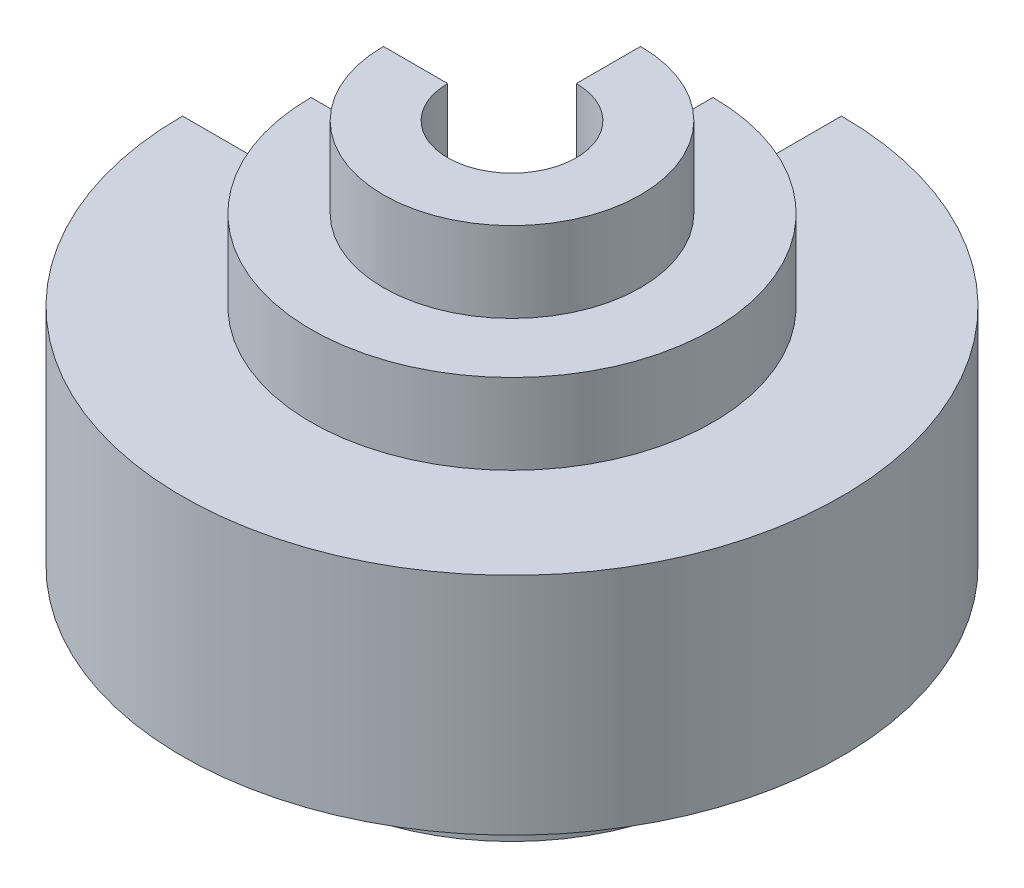
ISO-10303-21;
HEADER;
FILE_DESCRIPTION(('STEP AP214'),'2;1');
FILE_NAME('part.step','',(''),(''),'','','');
FILE_SCHEMA(('AUTOMOTIVE_DESIGN { 1 0 10303 214 1 1 1 1 }'));
ENDSEC;
DATA;
#1=APPLICATION_CONTEXT('core data for automotive mechanical design processes');
#2=APPLICATION_PROTOCOL_DEFINITION('international standard','automotive_design',2000,#1);
#3=PRODUCT_CONTEXT('',#1,'mechanical');
#4=PRODUCT('Part','Part','',(#3));
#5=PRODUCT_RELATED_PRODUCT_CATEGORY('part','',(#4));
#6=PRODUCT_DEFINITION_FORMATION('','',#4);
#7=PRODUCT_DEFINITION_CONTEXT('part definition',#1,'design');
#8=PRODUCT_DEFINITION('design','',#6,#7);
#9=PRODUCT_DEFINITION_SHAPE('','',#8);
#10=(LENGTH_UNIT() NAMED_UNIT(*) SI_UNIT(.MILLI.,.METRE.));
#11=(NAMED_UNIT(*) PLANE_ANGLE_UNIT() SI_UNIT($,.RADIAN.));
#12=(NAMED_UNIT(*) SI_UNIT($,.STERADIAN.) SOLID_ANGLE_UNIT());
#13=UNCERTAINTY_MEASURE_WITH_UNIT(LENGTH_MEASURE(1.E-05),#10,'distance_accuracy_value','');
#14=(GEOMETRIC_REPRESENTATION_CONTEXT(3) GLOBAL_UNCERTAINTY_ASSIGNED_CONTEXT((#13)) GLOBAL_UNIT_ASSIGNED_CONTEXT((#10,
#11,#12)) REPRESENTATION_CONTEXT('',''));
#15=CARTESIAN_POINT('',(0.,0.,0.));
#16=DIRECTION('',(0.,0.,1.));
#17=DIRECTION('',(1.,0.,0.));
#18=AXIS2_PLACEMENT_3D('',#15,#16,#17);
#19=CARTESIAN_POINT('',(0.,-107.271307940973,0.));
#20=DIRECTION('',(0.,-1.,0.));
#21=DIRECTION('',(0.,0.,-1.));
#22=AXIS2_PLACEMENT_3D('',#19,#20,#21);
#23=CYLINDRICAL_SURFACE('',#22,40.);
#24=CARTESIAN_POINT('',(0.,192.728692059027,0.));
#25=DIRECTION('',(0.,-1.,0.));
#26=DIRECTION('',(0.,0.,-1.));
#27=AXIS2_PLACEMENT_3D('',#24,#25,#26);
#28=CIRCLE('',#27,40.);
#29=CARTESIAN_POINT('',(-4.18977760661176E-13,192.728692059027,-40.));
#30=VERTEX_POINT('',#29);
#31=CARTESIAN_POINT('',(-40.,192.728692059027,0.));
#32=VERTEX_POINT('',#31);
#33=EDGE_CURVE('E11',#30,#32,#28,.T.);
#34=ORIENTED_EDGE('',*,*,#33,.F.);
#35=DIRECTION('',(0.,1.,0.));
#36=VECTOR('',#35,1.);
#37=CARTESIAN_POINT('',(-4.18977760661176E-13,107.728692059027,-40.));
#38=LINE('',#37,#36);
#39=CARTESIAN_POINT('',(-4.18977760661176E-13,107.728692059027,-40.));
#40=VERTEX_POINT('',#39);
#41=EDGE_CURVE('E204',#40,#30,#38,.T.);
#42=ORIENTED_EDGE('',*,*,#41,.F.);
#43=CARTESIAN_POINT('',(0.,107.728692059027,0.));
#44=DIRECTION('',(0.,-1.,0.));
#45=DIRECTION('',(0.,0.,-1.));
#46=AXIS2_PLACEMENT_3D('',#43,#44,#45);
#47=CIRCLE('',#46,40.);
#48=CARTESIAN_POINT('',(-40.,107.728692059027,0.));
#49=VERTEX_POINT('',#48);
#50=EDGE_CURVE('E48',#40,#49,#47,.T.);
#51=ORIENTED_EDGE('',*,*,#50,.T.);
#52=DIRECTION('',(0.,1.,0.));
#53=VECTOR('',#52,1.);
#54=CARTESIAN_POINT('',(-40.,107.728692059027,0.));
#55=LINE('',#54,#53);
#56=EDGE_CURVE('E156',#49,#32,#55,.T.);
#57=ORIENTED_EDGE('',*,*,#56,.T.);
#58=EDGE_LOOP('',(#34,#42,#51,#57));
#59=FACE_BOUND('',#58,.T.);
#60=ADVANCED_FACE('F33',(#59),#23,.F.);
#61=CARTESIAN_POINT('',(-4.18977760661176E-13,192.728692059027,-40.));
#62=DIRECTION('',(0.,-1.,0.));
#63=DIRECTION('',(0.,0.,-1.));
#64=AXIS2_PLACEMENT_3D('',#61,#62,#63);
#65=PLANE('',#64);
#66=CARTESIAN_POINT('',(0.,192.728692059027,0.));
#67=DIRECTION('',(0.,-1.,0.));
#68=DIRECTION('',(0.,0.,-1.));
#69=AXIS2_PLACEMENT_3D('',#66,#67,#68);
#70=CIRCLE('',#69,80.);
#71=CARTESIAN_POINT('',(-8.37955521322352E-13,192.728692059027,-80.));
#72=VERTEX_POINT('',#71);
#73=CARTESIAN_POINT('',(-80.,192.728692059027,0.));
#74=VERTEX_POINT('',#73);
#75=EDGE_CURVE('E41',#72,#74,#70,.T.);
#76=ORIENTED_EDGE('',*,*,#75,.F.);
#77=DIRECTION('',(0.,0.,-1.));
#78=VECTOR('',#77,1.);
#79=CARTESIAN_POINT('',(-4.18977760661176E-13,192.728692059027,-40.));
#80=LINE('',#79,#78);
#81=EDGE_CURVE('E152',#30,#72,#80,.T.);
#82=ORIENTED_EDGE('',*,*,#81,.F.);
#83=ORIENTED_EDGE('',*,*,#33,.T.);
#84=DIRECTION('',(-1.,0.,0.));
#85=VECTOR('',#84,1.);
#86=CARTESIAN_POINT('',(-40.,192.728692059027,0.));
#87=LINE('',#86,#85);
#88=EDGE_CURVE('E149',#32,#74,#87,.T.);
#89=ORIENTED_EDGE('',*,*,#88,.T.);
#90=EDGE_LOOP('',(#76,#82,#83,#89));
#91=FACE_BOUND('',#90,.T.);
#92=ADVANCED_FACE('F35',(#91),#65,.F.);
#93=CARTESIAN_POINT('',(0.,-107.271307940973,0.));
#94=DIRECTION('',(0.,-1.,0.));
#95=DIRECTION('',(0.,0.,-1.));
#96=AXIS2_PLACEMENT_3D('',#93,#94,#95);
#97=CYLINDRICAL_SURFACE('',#96,80.);
#98=CARTESIAN_POINT('',(0.,142.728692059027,0.));
#99=DIRECTION('',(0.,-1.,0.));
#100=DIRECTION('',(0.,0.,-1.));
#101=AXIS2_PLACEMENT_3D('',#98,#99,#100);
#102=CIRCLE('',#101,80.);
#103=CARTESIAN_POINT('',(-8.37955521322352E-13,142.728692059027,-80.));
#104=VERTEX_POINT('',#103);
#105=CARTESIAN_POINT('',(-80.,142.728692059027,0.));
#106=VERTEX_POINT('',#105);
#107=EDGE_CURVE('E272',#104,#106,#102,.T.);
#108=ORIENTED_EDGE('',*,*,#107,.F.);
#109=DIRECTION('',(0.,-1.,0.));
#110=VECTOR('',#109,1.);
#111=CARTESIAN_POINT('',(-8.37955521322352E-13,192.728692059027,-80.));
#112=LINE('',#111,#110);
#113=EDGE_CURVE('E207',#72,#104,#112,.T.);
#114=ORIENTED_EDGE('',*,*,#113,.F.);
#115=ORIENTED_EDGE('',*,*,#75,.T.);
#116=DIRECTION('',(0.,-1.,0.));
#117=VECTOR('',#116,1.);
#118=CARTESIAN_POINT('',(-80.,192.728692059027,0.));
#119=LINE('',#118,#117);
#120=EDGE_CURVE('E163',#74,#106,#119,.T.);
#121=ORIENTED_EDGE('',*,*,#120,.T.);
#122=EDGE_LOOP('',(#108,#114,#115,#121));
#123=FACE_BOUND('',#122,.T.);
#124=ADVANCED_FACE('F275',(#123),#97,.T.);
#125=CARTESIAN_POINT('',(-8.37955521322352E-13,142.728692059027,-80.));
#126=DIRECTION('',(0.,-1.,0.));
#127=DIRECTION('',(0.,0.,-1.));
#128=AXIS2_PLACEMENT_3D('',#125,#126,#127);
#129=PLANE('',#128);
#130=CARTESIAN_POINT('',(0.,142.728692059027,0.));
#131=DIRECTION('',(0.,-1.,0.));
#132=DIRECTION('',(0.,0.,-1.));
#133=AXIS2_PLACEMENT_3D('',#130,#131,#132);
#134=CIRCLE('',#133,125.);
#135=CARTESIAN_POINT('',(-1.30930550206618E-12,142.728692059027,-125.));
#136=VERTEX_POINT('',#135);
#137=CARTESIAN_POINT('',(-125.,142.728692059027,0.));
#138=VERTEX_POINT('',#137);
#139=EDGE_CURVE('E270',#136,#138,#134,.T.);
#140=ORIENTED_EDGE('',*,*,#139,.F.);
#141=DIRECTION('',(0.,0.,-1.));
#142=VECTOR('',#141,1.);
#143=CARTESIAN_POINT('',(-8.37955521322352E-13,142.728692059027,-80.));
#144=LINE('',#143,#142);
#145=EDGE_CURVE('E210',#104,#136,#144,.T.);
#146=ORIENTED_EDGE('',*,*,#145,.F.);
#147=ORIENTED_EDGE('',*,*,#107,.T.);
#148=DIRECTION('',(-1.,0.,0.));
#149=VECTOR('',#148,1.);
#150=CARTESIAN_POINT('',(-80.,142.728692059027,0.));
#151=LINE('',#150,#149);
#152=EDGE_CURVE('E165',#106,#138,#151,.T.);
#153=ORIENTED_EDGE('',*,*,#152,.T.);
#154=EDGE_LOOP('',(#140,#146,#147,#153));
#155=FACE_BOUND('',#154,.T.);
#156=ADVANCED_FACE('F323',(#155),#129,.F.);
#157=CARTESIAN_POINT('',(0.,-107.271307940973,0.));
#158=DIRECTION('',(0.,-1.,0.));
#159=DIRECTION('',(0.,0.,-1.));
#160=AXIS2_PLACEMENT_3D('',#157,#158,#159);
#161=CYLINDRICAL_SURFACE('',#160,125.);
#162=CARTESIAN_POINT('',(0.,92.7286920590267,0.));
#163=DIRECTION('',(0.,-1.,0.));
#164=DIRECTION('',(0.,0.,-1.));
#165=AXIS2_PLACEMENT_3D('',#162,#163,#164);
#166=CIRCLE('',#165,125.);
#167=CARTESIAN_POINT('',(-1.30930550206618E-12,92.7286920590267,-125.));
#168=VERTEX_POINT('',#167);
#169=CARTESIAN_POINT('',(-125.,92.7286920590267,0.));
#170=VERTEX_POINT('',#169);
#171=EDGE_CURVE('E268',#168,#170,#166,.T.);
#172=ORIENTED_EDGE('',*,*,#171,.F.);
#173=DIRECTION('',(0.,-1.,0.));
#174=VECTOR('',#173,1.);
#175=CARTESIAN_POINT('',(-1.30930550206618E-12,142.728692059027,-125.));
#176=LINE('',#175,#174);
#177=EDGE_CURVE('E213',#136,#168,#176,.T.);
#178=ORIENTED_EDGE('',*,*,#177,.F.);
#179=ORIENTED_EDGE('',*,*,#139,.T.);
#180=DIRECTION('',(0.,-1.,0.));
#181=VECTOR('',#180,1.);
#182=CARTESIAN_POINT('',(-125.,142.728692059027,0.));
#183=LINE('',#182,#181);
#184=EDGE_CURVE('E170',#138,#170,#183,.T.);
#185=ORIENTED_EDGE('',*,*,#184,.T.);
#186=EDGE_LOOP('',(#172,#178,#179,#185));
#187=FACE_BOUND('',#186,.T.);
#188=ADVANCED_FACE('F320',(#187),#161,.T.);
#189=CARTESIAN_POINT('',(-1.30930550206618E-12,92.7286920590267,-125.));
#190=DIRECTION('',(0.,-1.,0.));
#191=DIRECTION('',(0.,0.,-1.));
#192=AXIS2_PLACEMENT_3D('',#189,#190,#191);
#193=PLANE('',#192);
#194=CARTESIAN_POINT('',(0.,92.7286920590267,0.));
#195=DIRECTION('',(0.,-1.,0.));
#196=DIRECTION('',(0.,0.,-1.));
#197=AXIS2_PLACEMENT_3D('',#194,#195,#196);
#198=CIRCLE('',#197,205.);
#199=CARTESIAN_POINT('',(-2.14726102338853E-12,92.7286920590267,-205.));
#200=VERTEX_POINT('',#199);
#201=CARTESIAN_POINT('',(-205.,92.7286920590267,0.));
#202=VERTEX_POINT('',#201);
#203=EDGE_CURVE('E266',#200,#202,#198,.T.);
#204=ORIENTED_EDGE('',*,*,#203,.F.);
#205=DIRECTION('',(0.,0.,-1.));
#206=VECTOR('',#205,1.);
#207=CARTESIAN_POINT('',(-1.30930550206618E-12,92.7286920590267,-125.));
#208=LINE('',#207,#206);
#209=EDGE_CURVE('E216',#168,#200,#208,.T.);
#210=ORIENTED_EDGE('',*,*,#209,.F.);
#211=ORIENTED_EDGE('',*,*,#171,.T.);
#212=DIRECTION('',(-1.,0.,0.));
#213=VECTOR('',#212,1.);
#214=CARTESIAN_POINT('',(-125.,92.7286920590267,0.));
#215=LINE('',#214,#213);
#216=EDGE_CURVE('E173',#170,#202,#215,.T.);
#217=ORIENTED_EDGE('',*,*,#216,.T.);
#218=EDGE_LOOP('',(#204,#210,#211,#217));
#219=FACE_BOUND('',#218,.T.);
#220=ADVANCED_FACE('F317',(#219),#193,.F.);
#221=CARTESIAN_POINT('',(0.,-107.271307940973,0.));
#222=DIRECTION('',(0.,-1.,0.));
#223=DIRECTION('',(0.,0.,-1.));
#224=AXIS2_PLACEMENT_3D('',#221,#222,#223);
#225=CYLINDRICAL_SURFACE('',#224,205.);
#226=CARTESIAN_POINT('',(0.,-47.2713079409733,0.));
#227=DIRECTION('',(0.,-1.,0.));
#228=DIRECTION('',(0.,0.,-1.));
#229=AXIS2_PLACEMENT_3D('',#226,#227,#228);
#230=CIRCLE('',#229,205.);
#231=CARTESIAN_POINT('',(-2.14726102338853E-12,-47.2713079409733,-205.));
#232=VERTEX_POINT('',#231);
#233=CARTESIAN_POINT('',(-205.,-47.2713079409733,0.));
#234=VERTEX_POINT('',#233);
#235=EDGE_CURVE('E264',#232,#234,#230,.T.);
#236=ORIENTED_EDGE('',*,*,#235,.F.);
#237=DIRECTION('',(0.,-1.,0.));
#238=VECTOR('',#237,1.);
#239=CARTESIAN_POINT('',(-2.14726102338853E-12,92.7286920590267,-205.));
#240=LINE('',#239,#238);
#241=EDGE_CURVE('E219',#200,#232,#240,.T.);
#242=ORIENTED_EDGE('',*,*,#241,.F.);
#243=ORIENTED_EDGE('',*,*,#203,.T.);
#244=DIRECTION('',(0.,-1.,0.));
#245=VECTOR('',#244,1.);
#246=CARTESIAN_POINT('',(-205.,92.7286920590267,0.));
#247=LINE('',#246,#245);
#248=EDGE_CURVE('E176',#202,#234,#247,.T.);
#249=ORIENTED_EDGE('',*,*,#248,.T.);
#250=EDGE_LOOP('',(#236,#242,#243,#249));
#251=FACE_BOUND('',#250,.T.);
#252=ADVANCED_FACE('F314',(#251),#225,.T.);
#253=CARTESIAN_POINT('',(-2.14726102338853E-12,-47.2713079409733,-205.));
#254=DIRECTION('',(0.,1.,0.));
#255=DIRECTION('',(0.,0.,1.));
#256=AXIS2_PLACEMENT_3D('',#253,#254,#255);
#257=PLANE('',#256);
#258=CARTESIAN_POINT('',(0.,-47.2713079409733,0.));
#259=DIRECTION('',(0.,-1.,0.));
#260=DIRECTION('',(0.,0.,-1.));
#261=AXIS2_PLACEMENT_3D('',#258,#259,#260);
#262=CIRCLE('',#261,125.);
#263=CARTESIAN_POINT('',(-1.30930550206617E-12,-47.2713079409733,-125.));
#264=VERTEX_POINT('',#263);
#265=CARTESIAN_POINT('',(-125.,-47.2713079409733,0.));
#266=VERTEX_POINT('',#265);
#267=EDGE_CURVE('E262',#264,#266,#262,.T.);
#268=ORIENTED_EDGE('',*,*,#267,.F.);
#269=DIRECTION('',(0.,0.,1.));
#270=VECTOR('',#269,1.);
#271=CARTESIAN_POINT('',(-2.14726102338853E-12,-47.2713079409733,-205.));
#272=LINE('',#271,#270);
#273=EDGE_CURVE('E222',#232,#264,#272,.T.);
#274=ORIENTED_EDGE('',*,*,#273,.F.);
#275=ORIENTED_EDGE('',*,*,#235,.T.);
#276=DIRECTION('',(1.,0.,0.));
#277=VECTOR('',#276,1.);
#278=CARTESIAN_POINT('',(-205.,-47.2713079409733,0.));
#279=LINE('',#278,#277);
#280=EDGE_CURVE('E179',#234,#266,#279,.T.);
#281=ORIENTED_EDGE('',*,*,#280,.T.);
#282=EDGE_LOOP('',(#268,#274,#275,#281));
#283=FACE_BOUND('',#282,.T.);
#284=ADVANCED_FACE('F310',(#283),#257,.F.);
#285=CARTESIAN_POINT('',(0.,-107.271307940973,0.));
#286=DIRECTION('',(0.,-1.,0.));
#287=DIRECTION('',(0.,0.,-1.));
#288=AXIS2_PLACEMENT_3D('',#285,#286,#287);
#289=CYLINDRICAL_SURFACE('',#288,125.);
#290=CARTESIAN_POINT('',(0.,-107.271307940973,0.));
#291=DIRECTION('',(0.,-1.,0.));
#292=DIRECTION('',(0.,0.,-1.));
#293=AXIS2_PLACEMENT_3D('',#290,#291,#292);
#294=CIRCLE('',#293,125.);
#295=CARTESIAN_POINT('',(-1.30930550206617E-12,-107.271307940973,-125.));
#296=VERTEX_POINT('',#295);
#297=CARTESIAN_POINT('',(-125.,-107.271307940973,0.));
#298=VERTEX_POINT('',#297);
#299=EDGE_CURVE('E260',#296,#298,#294,.T.);
#300=ORIENTED_EDGE('',*,*,#299,.F.);
#301=DIRECTION('',(0.,-1.,0.));
#302=VECTOR('',#301,1.);
#303=CARTESIAN_POINT('',(-1.30930550206617E-12,-47.2713079409733,-125.));
#304=LINE('',#303,#302);
#305=EDGE_CURVE('E225',#264,#296,#304,.T.);
#306=ORIENTED_EDGE('',*,*,#305,.F.);
#307=ORIENTED_EDGE('',*,*,#267,.T.);
#308=DIRECTION('',(0.,-1.,0.));
#309=VECTOR('',#308,1.);
#310=CARTESIAN_POINT('',(-125.,-47.2713079409733,0.));
#311=LINE('',#310,#309);
#312=EDGE_CURVE('E182',#266,#298,#311,.T.);
#313=ORIENTED_EDGE('',*,*,#312,.T.);
#314=EDGE_LOOP('',(#300,#306,#307,#313));
#315=FACE_BOUND('',#314,.T.);
#316=ADVANCED_FACE('F305',(#315),#289,.T.);
#317=CARTESIAN_POINT('',(-1.30930550206617E-12,-107.271307940973,-125.));
#318=DIRECTION('',(0.,1.,0.));
#319=DIRECTION('',(0.,0.,1.));
#320=AXIS2_PLACEMENT_3D('',#317,#318,#319);
#321=PLANE('',#320);
#322=CARTESIAN_POINT('',(0.,-107.271307940973,0.));
#323=DIRECTION('',(0.,-1.,0.));
#324=DIRECTION('',(0.,0.,-1.));
#325=AXIS2_PLACEMENT_3D('',#322,#323,#324);
#326=CIRCLE('',#325,60.);
#327=CARTESIAN_POINT('',(-6.28466640991764E-13,-107.271307940973,-60.));
#328=VERTEX_POINT('',#327);
#329=CARTESIAN_POINT('',(-60.,-107.271307940973,0.));
#330=VERTEX_POINT('',#329);
#331=EDGE_CURVE('E258',#328,#330,#326,.T.);
#332=ORIENTED_EDGE('',*,*,#331,.F.);
#333=DIRECTION('',(0.,0.,1.));
#334=VECTOR('',#333,1.);
#335=CARTESIAN_POINT('',(-1.30930550206617E-12,-107.271307940973,-125.));
#336=LINE('',#335,#334);
#337=EDGE_CURVE('E228',#296,#328,#336,.T.);
#338=ORIENTED_EDGE('',*,*,#337,.F.);
#339=ORIENTED_EDGE('',*,*,#299,.T.);
#340=DIRECTION('',(1.,0.,0.));
#341=VECTOR('',#340,1.);
#342=CARTESIAN_POINT('',(-125.,-107.271307940973,0.));
#343=LINE('',#342,#341);
#344=EDGE_CURVE('E185',#298,#330,#343,.T.);
#345=ORIENTED_EDGE('',*,*,#344,.T.);
#346=EDGE_LOOP('',(#332,#338,#339,#345));
#347=FACE_BOUND('',#346,.T.);
#348=ADVANCED_FACE('F302',(#347),#321,.F.);
#349=CARTESIAN_POINT('',(0.,-107.271307940973,0.));
#350=DIRECTION('',(0.,-1.,0.));
#351=DIRECTION('',(0.,0.,-1.));
#352=AXIS2_PLACEMENT_3D('',#349,#350,#351);
#353=CYLINDRICAL_SURFACE('',#352,60.);
#354=CARTESIAN_POINT('',(0.,-7.27130794097325,0.));
#355=DIRECTION('',(0.,-1.,0.));
#356=DIRECTION('',(0.,0.,-1.));
#357=AXIS2_PLACEMENT_3D('',#354,#355,#356);
#358=CIRCLE('',#357,60.);
#359=CARTESIAN_POINT('',(-6.28466640991764E-13,-7.27130794097325,-60.));
#360=VERTEX_POINT('',#359);
#361=CARTESIAN_POINT('',(-60.,-7.27130794097325,0.));
#362=VERTEX_POINT('',#361);
#363=EDGE_CURVE('E256',#360,#362,#358,.T.);
#364=ORIENTED_EDGE('',*,*,#363,.F.);
#365=DIRECTION('',(0.,1.,0.));
#366=VECTOR('',#365,1.);
#367=CARTESIAN_POINT('',(-6.28466640991764E-13,-107.271307940973,-60.));
#368=LINE('',#367,#366);
#369=EDGE_CURVE('E231',#328,#360,#368,.T.);
#370=ORIENTED_EDGE('',*,*,#369,.F.);
#371=ORIENTED_EDGE('',*,*,#331,.T.);
#372=DIRECTION('',(0.,1.,0.));
#373=VECTOR('',#372,1.);
#374=CARTESIAN_POINT('',(-60.,-107.271307940973,0.));
#375=LINE('',#374,#373);
#376=EDGE_CURVE('E188',#330,#362,#375,.T.);
#377=ORIENTED_EDGE('',*,*,#376,.T.);
#378=EDGE_LOOP('',(#364,#370,#371,#377));
#379=FACE_BOUND('',#378,.T.);
#380=ADVANCED_FACE('F298',(#379),#353,.F.);
#381=CARTESIAN_POINT('',(-6.28466640991764E-13,-7.27130794097325,-60.));
#382=DIRECTION('',(0.,-1.,0.));
#383=DIRECTION('',(0.,0.,-1.));
#384=AXIS2_PLACEMENT_3D('',#381,#382,#383);
#385=PLANE('',#384);
#386=CARTESIAN_POINT('',(0.,-7.27130794097326,0.));
#387=DIRECTION('',(0.,-1.,0.));
#388=DIRECTION('',(0.,0.,-1.));
#389=AXIS2_PLACEMENT_3D('',#386,#387,#388);
#390=CIRCLE('',#389,155.);
#391=CARTESIAN_POINT('',(-1.62353882256206E-12,-7.27130794097326,-155.));
#392=VERTEX_POINT('',#391);
#393=CARTESIAN_POINT('',(-155.,-7.27130794097326,0.));
#394=VERTEX_POINT('',#393);
#395=EDGE_CURVE('E254',#392,#394,#390,.T.);
#396=ORIENTED_EDGE('',*,*,#395,.F.);
#397=DIRECTION('',(0.,0.,-1.));
#398=VECTOR('',#397,1.);
#399=CARTESIAN_POINT('',(-6.28466640991764E-13,-7.27130794097325,-60.));
#400=LINE('',#399,#398);
#401=EDGE_CURVE('E234',#360,#392,#400,.T.);
#402=ORIENTED_EDGE('',*,*,#401,.F.);
#403=ORIENTED_EDGE('',*,*,#363,.T.);
#404=DIRECTION('',(-1.,0.,0.));
#405=VECTOR('',#404,1.);
#406=CARTESIAN_POINT('',(-60.,-7.27130794097325,0.));
#407=LINE('',#406,#405);
#408=EDGE_CURVE('E191',#362,#394,#407,.T.);
#409=ORIENTED_EDGE('',*,*,#408,.T.);
#410=EDGE_LOOP('',(#396,#402,#403,#409));
#411=FACE_BOUND('',#410,.T.);
#412=ADVANCED_FACE('F293',(#411),#385,.F.);
#413=CARTESIAN_POINT('',(0.,-107.271307940973,0.));
#414=DIRECTION('',(0.,-1.,0.));
#415=DIRECTION('',(0.,0.,-1.));
#416=AXIS2_PLACEMENT_3D('',#413,#414,#415);
#417=CYLINDRICAL_SURFACE('',#416,155.);
#418=CARTESIAN_POINT('',(0.,57.7286920590268,0.));
#419=DIRECTION('',(0.,-1.,0.));
#420=DIRECTION('',(0.,0.,-1.));
#421=AXIS2_PLACEMENT_3D('',#418,#419,#420);
#422=CIRCLE('',#421,155.);
#423=CARTESIAN_POINT('',(-1.62353882256206E-12,57.7286920590267,-155.));
#424=VERTEX_POINT('',#423);
#425=CARTESIAN_POINT('',(-155.,57.7286920590267,0.));
#426=VERTEX_POINT('',#425);
#427=EDGE_CURVE('E252',#424,#426,#422,.T.);
#428=ORIENTED_EDGE('',*,*,#427,.F.);
#429=DIRECTION('',(0.,1.,0.));
#430=VECTOR('',#429,1.);
#431=CARTESIAN_POINT('',(-1.62353882256206E-12,-7.27130794097326,-155.));
#432=LINE('',#431,#430);
#433=EDGE_CURVE('E237',#392,#424,#432,.T.);
#434=ORIENTED_EDGE('',*,*,#433,.F.);
#435=ORIENTED_EDGE('',*,*,#395,.T.);
#436=DIRECTION('',(0.,1.,0.));
#437=VECTOR('',#436,1.);
#438=CARTESIAN_POINT('',(-155.,-7.27130794097326,0.));
#439=LINE('',#438,#437);
#440=EDGE_CURVE('E194',#394,#426,#439,.T.);
#441=ORIENTED_EDGE('',*,*,#440,.T.);
#442=EDGE_LOOP('',(#428,#434,#435,#441));
#443=FACE_BOUND('',#442,.T.);
#444=ADVANCED_FACE('F290',(#443),#417,.F.);
#445=CARTESIAN_POINT('',(-1.62353882256206E-12,57.7286920590267,-155.));
#446=DIRECTION('',(0.,1.,0.));
#447=DIRECTION('',(0.,0.,1.));
#448=AXIS2_PLACEMENT_3D('',#445,#446,#447);
#449=PLANE('',#448);
#450=CARTESIAN_POINT('',(0.,57.7286920590268,0.));
#451=DIRECTION('',(0.,-1.,0.));
#452=DIRECTION('',(0.,0.,-1.));
#453=AXIS2_PLACEMENT_3D('',#450,#451,#452);
#454=CIRCLE('',#453,75.);
#455=CARTESIAN_POINT('',(-7.85583301239705E-13,57.7286920590267,-75.));
#456=VERTEX_POINT('',#455);
#457=CARTESIAN_POINT('',(-75.,57.7286920590267,0.));
#458=VERTEX_POINT('',#457);
#459=EDGE_CURVE('E250',#456,#458,#454,.T.);
#460=ORIENTED_EDGE('',*,*,#459,.F.);
#461=DIRECTION('',(0.,0.,1.));
#462=VECTOR('',#461,1.);
#463=CARTESIAN_POINT('',(-1.62353882256206E-12,57.7286920590267,-155.));
#464=LINE('',#463,#462);
#465=EDGE_CURVE('E240',#424,#456,#464,.T.);
#466=ORIENTED_EDGE('',*,*,#465,.F.);
#467=ORIENTED_EDGE('',*,*,#427,.T.);
#468=DIRECTION('',(1.,0.,0.));
#469=VECTOR('',#468,1.);
#470=CARTESIAN_POINT('',(-155.,57.7286920590267,0.));
#471=LINE('',#470,#469);
#472=EDGE_CURVE('E197',#426,#458,#471,.T.);
#473=ORIENTED_EDGE('',*,*,#472,.T.);
#474=EDGE_LOOP('',(#460,#466,#467,#473));
#475=FACE_BOUND('',#474,.T.);
#476=ADVANCED_FACE('F286',(#475),#449,.F.);
#477=CARTESIAN_POINT('',(0.,-107.271307940973,0.));
#478=DIRECTION('',(0.,-1.,0.));
#479=DIRECTION('',(0.,0.,-1.));
#480=AXIS2_PLACEMENT_3D('',#477,#478,#479);
#481=CYLINDRICAL_SURFACE('',#480,75.);
#482=CARTESIAN_POINT('',(0.,107.728692059027,0.));
#483=DIRECTION('',(0.,-1.,0.));
#484=DIRECTION('',(0.,0.,-1.));
#485=AXIS2_PLACEMENT_3D('',#482,#483,#484);
#486=CIRCLE('',#485,75.);
#487=CARTESIAN_POINT('',(-7.85583301239705E-13,107.728692059027,-75.));
#488=VERTEX_POINT('',#487);
#489=CARTESIAN_POINT('',(-75.,107.728692059027,0.));
#490=VERTEX_POINT('',#489);
#491=EDGE_CURVE('E56',#488,#490,#486,.T.);
#492=ORIENTED_EDGE('',*,*,#491,.F.);
#493=DIRECTION('',(0.,1.,0.));
#494=VECTOR('',#493,1.);
#495=CARTESIAN_POINT('',(-7.85583301239705E-13,57.7286920590267,-75.));
#496=LINE('',#495,#494);
#497=EDGE_CURVE('E243',#456,#488,#496,.T.);
#498=ORIENTED_EDGE('',*,*,#497,.F.);
#499=ORIENTED_EDGE('',*,*,#459,.T.);
#500=DIRECTION('',(0.,1.,0.));
#501=VECTOR('',#500,1.);
#502=CARTESIAN_POINT('',(-75.,57.7286920590267,0.));
#503=LINE('',#502,#501);
#504=EDGE_CURVE('E200',#458,#490,#503,.T.);
#505=ORIENTED_EDGE('',*,*,#504,.T.);
#506=EDGE_LOOP('',(#492,#498,#499,#505));
#507=FACE_BOUND('',#506,.T.);
#508=ADVANCED_FACE('F281',(#507),#481,.F.);
#509=CARTESIAN_POINT('',(-7.85583301239705E-13,107.728692059027,-75.));
#510=DIRECTION('',(0.,1.,0.));
#511=DIRECTION('',(0.,0.,1.));
#512=AXIS2_PLACEMENT_3D('',#509,#510,#511);
#513=PLANE('',#512);
#514=DIRECTION('',(0.,0.,1.));
#515=VECTOR('',#514,1.);
#516=CARTESIAN_POINT('',(-7.85583301239705E-13,107.728692059027,-75.));
#517=LINE('',#516,#515);
#518=EDGE_CURVE('E245',#488,#40,#517,.T.);
#519=ORIENTED_EDGE('',*,*,#518,.F.);
#520=ORIENTED_EDGE('',*,*,#491,.T.);
#521=DIRECTION('',(1.,0.,0.));
#522=VECTOR('',#521,1.);
#523=CARTESIAN_POINT('',(-75.,107.728692059027,0.));
#524=LINE('',#523,#522);
#525=EDGE_CURVE('E202',#490,#49,#524,.T.);
#526=ORIENTED_EDGE('',*,*,#525,.T.);
#527=ORIENTED_EDGE('',*,*,#50,.F.);
#528=EDGE_LOOP('',(#519,#520,#526,#527));
#529=FACE_BOUND('',#528,.T.);
#530=ADVANCED_FACE('F279',(#529),#513,.F.);
#531=CARTESIAN_POINT('',(0.,0.,0.));
#532=DIRECTION('',(-1.,0.,0.));
#533=DIRECTION('',(0.,0.,1.));
#534=AXIS2_PLACEMENT_3D('',#531,#532,#533);
#535=PLANE('',#534);
#536=ORIENTED_EDGE('',*,*,#41,.T.);
#537=ORIENTED_EDGE('',*,*,#81,.T.);
#538=ORIENTED_EDGE('',*,*,#113,.T.);
#539=ORIENTED_EDGE('',*,*,#145,.T.);
#540=ORIENTED_EDGE('',*,*,#177,.T.);
#541=ORIENTED_EDGE('',*,*,#209,.T.);
#542=ORIENTED_EDGE('',*,*,#241,.T.);
#543=ORIENTED_EDGE('',*,*,#273,.T.);
#544=ORIENTED_EDGE('',*,*,#305,.T.);
#545=ORIENTED_EDGE('',*,*,#337,.T.);
#546=ORIENTED_EDGE('',*,*,#369,.T.);
#547=ORIENTED_EDGE('',*,*,#401,.T.);
#548=ORIENTED_EDGE('',*,*,#433,.T.);
#549=ORIENTED_EDGE('',*,*,#465,.T.);
#550=ORIENTED_EDGE('',*,*,#497,.T.);
#551=ORIENTED_EDGE('',*,*,#518,.T.);
#552=EDGE_LOOP('',(#536,#537,#538,#539,#540,#541,#542,#543,#544,#545,#546,#547,#548,#549,#550,#551));
#553=FACE_BOUND('',#552,.T.);
#554=ADVANCED_FACE('F277',(#553),#535,.T.);
#555=CARTESIAN_POINT('',(0.,0.,0.));
#556=DIRECTION('',(0.,0.,1.));
#557=DIRECTION('',(1.,0.,0.));
#558=AXIS2_PLACEMENT_3D('',#555,#556,#557);
#559=PLANE('',#558);
#560=ORIENTED_EDGE('',*,*,#56,.F.);
#561=ORIENTED_EDGE('',*,*,#525,.F.);
#562=ORIENTED_EDGE('',*,*,#504,.F.);
#563=ORIENTED_EDGE('',*,*,#472,.F.);
#564=ORIENTED_EDGE('',*,*,#440,.F.);
#565=ORIENTED_EDGE('',*,*,#408,.F.);
#566=ORIENTED_EDGE('',*,*,#376,.F.);
#567=ORIENTED_EDGE('',*,*,#344,.F.);
#568=ORIENTED_EDGE('',*,*,#312,.F.);
#569=ORIENTED_EDGE('',*,*,#280,.F.);
#570=ORIENTED_EDGE('',*,*,#248,.F.);
#571=ORIENTED_EDGE('',*,*,#216,.F.);
#572=ORIENTED_EDGE('',*,*,#184,.F.);
#573=ORIENTED_EDGE('',*,*,#152,.F.);
#574=ORIENTED_EDGE('',*,*,#120,.F.);
#575=ORIENTED_EDGE('',*,*,#88,.F.);
#576=EDGE_LOOP('',(#560,#561,#562,#563,#564,#565,#566,#567,#568,#569,#570,#571,#572,#573,#574,#575));
#577=FACE_BOUND('',#576,.T.);
#578=ADVANCED_FACE('F160',(#577),#559,.F.);
#579=CLOSED_SHELL('',(#60,#92,#124,#156,#188,#220,#252,#284,#316,#348,#380,#412,#444,#476,#508,
#530,#554,#578));
#580=MANIFOLD_SOLID_BREP('B2',#579);
#581=ADVANCED_BREP_SHAPE_REPRESENTATION('',(#18,#580),#14);
#582=SHAPE_DEFINITION_REPRESENTATION(#9,#581);
ENDSEC;
END-ISO-10303-21;
